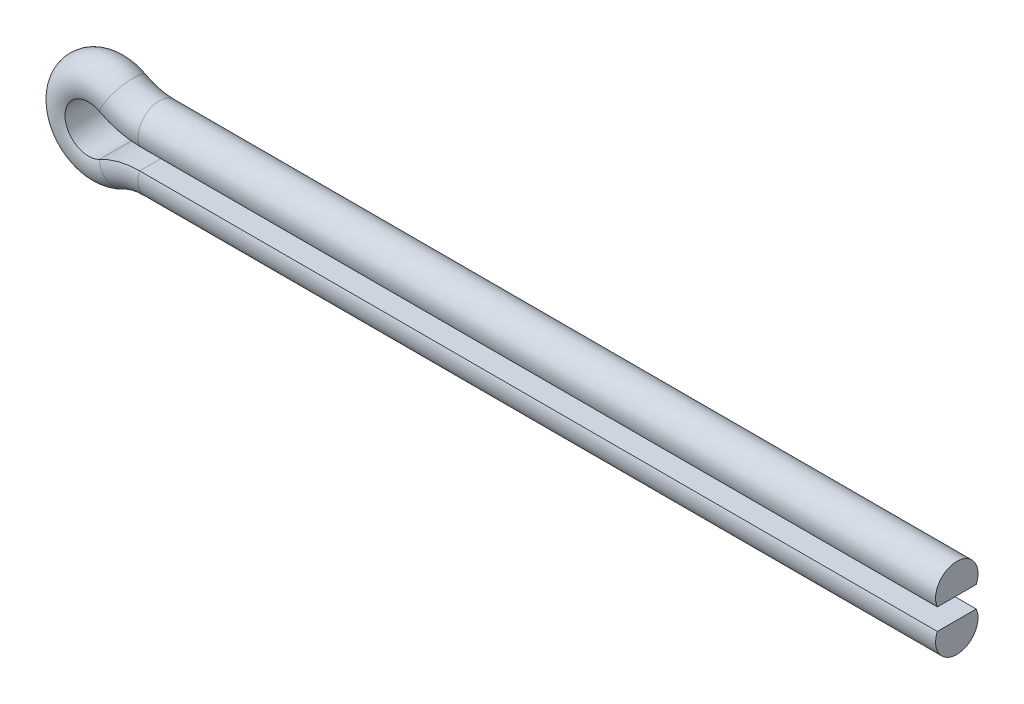
ISO-10303-21;
HEADER;
FILE_DESCRIPTION(('STEP AP214'),'2;1');
FILE_NAME('part.step','',(''),(''),'','','');
FILE_SCHEMA(('AUTOMOTIVE_DESIGN { 1 0 10303 214 1 1 1 1 }'));
ENDSEC;
DATA;
#1=APPLICATION_CONTEXT('core data for automotive mechanical design processes');
#2=APPLICATION_PROTOCOL_DEFINITION('international standard','automotive_design',2000,#1);
#3=PRODUCT_CONTEXT('',#1,'mechanical');
#4=PRODUCT('Part','Part','',(#3));
#5=PRODUCT_RELATED_PRODUCT_CATEGORY('part','',(#4));
#6=PRODUCT_DEFINITION_FORMATION('','',#4);
#7=PRODUCT_DEFINITION_CONTEXT('part definition',#1,'design');
#8=PRODUCT_DEFINITION('design','',#6,#7);
#9=PRODUCT_DEFINITION_SHAPE('','',#8);
#10=(LENGTH_UNIT() NAMED_UNIT(*) SI_UNIT(.MILLI.,.METRE.));
#11=(NAMED_UNIT(*) PLANE_ANGLE_UNIT() SI_UNIT($,.RADIAN.));
#12=(NAMED_UNIT(*) SI_UNIT($,.STERADIAN.) SOLID_ANGLE_UNIT());
#13=UNCERTAINTY_MEASURE_WITH_UNIT(LENGTH_MEASURE(1.E-05),#10,'distance_accuracy_value','');
#14=(GEOMETRIC_REPRESENTATION_CONTEXT(3) GLOBAL_UNCERTAINTY_ASSIGNED_CONTEXT((#13)) GLOBAL_UNIT_ASSIGNED_CONTEXT((#10,
#11,#12)) REPRESENTATION_CONTEXT('',''));
#15=CARTESIAN_POINT('',(0.,0.,0.));
#16=DIRECTION('',(0.,0.,1.));
#17=DIRECTION('',(1.,0.,0.));
#18=AXIS2_PLACEMENT_3D('',#15,#16,#17);
#19=CARTESIAN_POINT('',(100.,-2.25011983898101,0.));
#20=DIRECTION('',(-1.,0.,0.));
#21=DIRECTION('',(0.,-1.,0.));
#22=AXIS2_PLACEMENT_3D('',#19,#20,#21);
#23=PLANE('',#22);
#24=CARTESIAN_POINT('',(100.,-2.25011983898101,0.));
#25=DIRECTION('',(-1.,0.,0.));
#26=DIRECTION('',(0.,-1.,0.));
#27=AXIS2_PLACEMENT_3D('',#24,#25,#26);
#28=CIRCLE('',#27,2.5);
#29=CARTESIAN_POINT('',(100.,-1.25011983898101,-2.29128784747792));
#30=VERTEX_POINT('',#29);
#31=CARTESIAN_POINT('',(100.,-1.25011983898101,2.29128784747792));
#32=VERTEX_POINT('',#31);
#33=EDGE_CURVE('E90',#30,#32,#28,.T.);
#34=ORIENTED_EDGE('',*,*,#33,.F.);
#35=DIRECTION('',(0.,0.,-1.));
#36=VECTOR('',#35,1.);
#37=CARTESIAN_POINT('',(100.,-1.25011983898101,2.29128784747792));
#38=LINE('',#37,#36);
#39=EDGE_CURVE('E92',#32,#30,#38,.T.);
#40=ORIENTED_EDGE('',*,*,#39,.F.);
#41=EDGE_LOOP('',(#34,#40));
#42=FACE_BOUND('',#41,.T.);
#43=ADVANCED_FACE('F43',(#42),#23,.F.);
#44=CARTESIAN_POINT('',(100.,2.25011983898101,0.));
#45=DIRECTION('',(1.,0.,0.));
#46=DIRECTION('',(0.,1.,0.));
#47=AXIS2_PLACEMENT_3D('',#44,#45,#46);
#48=PLANE('',#47);
#49=CARTESIAN_POINT('',(100.,2.25011983898101,0.));
#50=DIRECTION('',(1.,0.,0.));
#51=DIRECTION('',(0.,1.,0.));
#52=AXIS2_PLACEMENT_3D('',#49,#50,#51);
#53=CIRCLE('',#52,2.5);
#54=CARTESIAN_POINT('',(100.,1.25011983898101,-2.29128784747792));
#55=VERTEX_POINT('',#54);
#56=CARTESIAN_POINT('',(100.,1.25011983898101,2.29128784747792));
#57=VERTEX_POINT('',#56);
#58=EDGE_CURVE('E56',#55,#57,#53,.T.);
#59=ORIENTED_EDGE('',*,*,#58,.T.);
#60=DIRECTION('',(0.,0.,-1.));
#61=VECTOR('',#60,1.);
#62=CARTESIAN_POINT('',(100.,1.25011983898101,2.29128784747792));
#63=LINE('',#62,#61);
#64=EDGE_CURVE('E11',#57,#55,#63,.T.);
#65=ORIENTED_EDGE('',*,*,#64,.T.);
#66=EDGE_LOOP('',(#59,#65));
#67=FACE_BOUND('',#66,.T.);
#68=ADVANCED_FACE('F216',(#67),#48,.T.);
#69=CARTESIAN_POINT('',(100.,-2.25011983898101,0.));
#70=DIRECTION('',(-1.,0.,0.));
#71=DIRECTION('',(0.,-1.,0.));
#72=AXIS2_PLACEMENT_3D('',#69,#70,#71);
#73=CYLINDRICAL_SURFACE('',#72,2.5);
#74=DIRECTION('',(-1.,0.,0.));
#75=VECTOR('',#74,1.);
#76=CARTESIAN_POINT('',(100.,-1.25011983898101,2.29128784747792));
#77=LINE('',#76,#75);
#78=CARTESIAN_POINT('',(6.03109484312739,-1.25011983898101,2.29128784747792));
#79=VERTEX_POINT('',#78);
#80=EDGE_CURVE('E104',#32,#79,#77,.T.);
#81=ORIENTED_EDGE('',*,*,#80,.T.);
#82=CARTESIAN_POINT('',(6.03109484312739,-2.25011983898101,0.));
#83=DIRECTION('',(-1.,0.,0.));
#84=DIRECTION('',(0.,-1.,0.));
#85=AXIS2_PLACEMENT_3D('',#82,#83,#84);
#86=CIRCLE('',#85,2.5);
#87=CARTESIAN_POINT('',(6.03109484312739,-1.25011983898101,-2.29128784747792));
#88=VERTEX_POINT('',#87);
#89=EDGE_CURVE('E110',#88,#79,#86,.T.);
#90=ORIENTED_EDGE('',*,*,#89,.F.);
#91=DIRECTION('',(-1.,0.,0.));
#92=VECTOR('',#91,1.);
#93=CARTESIAN_POINT('',(100.,-1.25011983898101,-2.29128784747792));
#94=LINE('',#93,#92);
#95=EDGE_CURVE('E103',#30,#88,#94,.T.);
#96=ORIENTED_EDGE('',*,*,#95,.F.);
#97=ORIENTED_EDGE('',*,*,#33,.T.);
#98=EDGE_LOOP('',(#81,#90,#96,#97));
#99=FACE_BOUND('',#98,.T.);
#100=ADVANCED_FACE('F108',(#99),#73,.T.);
#101=CARTESIAN_POINT('',(100.,-1.25011983898101,2.29128784747792));
#102=DIRECTION('',(0.,1.,0.));
#103=DIRECTION('',(-1.,0.,0.));
#104=AXIS2_PLACEMENT_3D('',#101,#102,#103);
#105=PLANE('',#104);
#106=DIRECTION('',(0.,0.,-1.));
#107=VECTOR('',#106,1.);
#108=CARTESIAN_POINT('',(6.03109484312739,-1.25011983898101,2.29128784747792));
#109=LINE('',#108,#107);
#110=EDGE_CURVE('E130',#79,#88,#109,.T.);
#111=ORIENTED_EDGE('',*,*,#110,.F.);
#112=ORIENTED_EDGE('',*,*,#80,.F.);
#113=ORIENTED_EDGE('',*,*,#39,.T.);
#114=ORIENTED_EDGE('',*,*,#95,.T.);
#115=EDGE_LOOP('',(#111,#112,#113,#114));
#116=FACE_BOUND('',#115,.T.);
#117=ADVANCED_FACE('F102',(#116),#105,.T.);
#118=CARTESIAN_POINT('',(6.03109484312738,-11.25,0.));
#119=DIRECTION('',(0.,0.,1.));
#120=DIRECTION('',(1.,0.,0.));
#121=AXIS2_PLACEMENT_3D('',#118,#119,#120);
#122=TOROIDAL_SURFACE('',#121,8.99988016101899,2.5);
#123=CARTESIAN_POINT('',(6.03109484312738,-11.25,2.29128784747792));
#124=DIRECTION('',(0.,0.,1.));
#125=DIRECTION('',(0.,1.,0.));
#126=AXIS2_PLACEMENT_3D('',#123,#124,#125);
#127=CIRCLE('',#126,9.99988016101899);
#128=CARTESIAN_POINT('',(1.30631450822039,-2.43671150922556,2.29128784747792));
#129=VERTEX_POINT('',#128);
#130=EDGE_CURVE('E121',#79,#129,#127,.T.);
#131=ORIENTED_EDGE('',*,*,#130,.T.);
#132=CARTESIAN_POINT('',(1.77879820390756,-3.31805092018469,0.));
#133=DIRECTION('',(-0.881339410959138,-0.472483695687163,0.));
#134=DIRECTION('',(0.472483695687163,-0.881339410959138,0.));
#135=AXIS2_PLACEMENT_3D('',#132,#133,#134);
#136=CIRCLE('',#135,2.5);
#137=CARTESIAN_POINT('',(1.30631450822039,-2.43671150922556,-2.29128784747792));
#138=VERTEX_POINT('',#137);
#139=EDGE_CURVE('E117',#138,#129,#136,.T.);
#140=ORIENTED_EDGE('',*,*,#139,.F.);
#141=CARTESIAN_POINT('',(6.03109484312738,-11.25,-2.29128784747792));
#142=DIRECTION('',(0.,0.,1.));
#143=DIRECTION('',(0.,1.,0.));
#144=AXIS2_PLACEMENT_3D('',#141,#142,#143);
#145=CIRCLE('',#144,9.99988016101899);
#146=EDGE_CURVE('E122',#88,#138,#145,.T.);
#147=ORIENTED_EDGE('',*,*,#146,.F.);
#148=ORIENTED_EDGE('',*,*,#89,.T.);
#149=EDGE_LOOP('',(#131,#140,#147,#148));
#150=FACE_BOUND('',#149,.T.);
#151=ADVANCED_FACE('F195',(#150),#122,.T.);
#152=CARTESIAN_POINT('',(6.03109484312738,-11.25,0.));
#153=DIRECTION('',(0.,0.,1.));
#154=DIRECTION('',(1.,0.,0.));
#155=AXIS2_PLACEMENT_3D('',#152,#153,#154);
#156=CYLINDRICAL_SURFACE('',#155,9.99988016101899);
#157=DIRECTION('',(0.,0.,-1.));
#158=VECTOR('',#157,1.);
#159=CARTESIAN_POINT('',(1.30631450822039,-2.43671150922555,2.29128784747792));
#160=LINE('',#159,#158);
#161=EDGE_CURVE('E126',#129,#138,#160,.T.);
#162=ORIENTED_EDGE('',*,*,#161,.F.);
#163=ORIENTED_EDGE('',*,*,#130,.F.);
#164=ORIENTED_EDGE('',*,*,#110,.T.);
#165=ORIENTED_EDGE('',*,*,#146,.T.);
#166=EDGE_LOOP('',(#162,#163,#164,#165));
#167=FACE_BOUND('',#166,.T.);
#168=ADVANCED_FACE('F196',(#167),#156,.T.);
#169=CARTESIAN_POINT('',(0.,0.,0.));
#170=DIRECTION('',(0.,0.,-1.));
#171=DIRECTION('',(-1.,0.,0.));
#172=AXIS2_PLACEMENT_3D('',#169,#170,#171);
#173=TOROIDAL_SURFACE('',#172,3.76478219279193,2.5);
#174=CARTESIAN_POINT('',(0.,0.,2.29128784747792));
#175=DIRECTION('',(0.,0.,-1.));
#176=DIRECTION('',(0.472483695687162,-0.881339410959138,0.));
#177=AXIS2_PLACEMENT_3D('',#174,#175,#176);
#178=CIRCLE('',#177,2.76478219279193);
#179=CARTESIAN_POINT('',(1.30631450822038,2.43671150922555,2.29128784747792));
#180=VERTEX_POINT('',#179);
#181=EDGE_CURVE('E135',#129,#180,#178,.T.);
#182=ORIENTED_EDGE('',*,*,#181,.T.);
#183=CARTESIAN_POINT('',(1.77879820390754,3.3180509201847,0.));
#184=DIRECTION('',(0.881339410959139,-0.472483695687162,0.));
#185=DIRECTION('',(0.472483695687162,0.881339410959139,0.));
#186=AXIS2_PLACEMENT_3D('',#183,#184,#185);
#187=CIRCLE('',#186,2.5);
#188=CARTESIAN_POINT('',(1.30631450822038,2.43671150922555,-2.29128784747792));
#189=VERTEX_POINT('',#188);
#190=EDGE_CURVE('E131',#189,#180,#187,.T.);
#191=ORIENTED_EDGE('',*,*,#190,.F.);
#192=CARTESIAN_POINT('',(0.,0.,-2.29128784747792));
#193=DIRECTION('',(0.,0.,-1.));
#194=DIRECTION('',(0.472483695687162,-0.881339410959138,0.));
#195=AXIS2_PLACEMENT_3D('',#192,#193,#194);
#196=CIRCLE('',#195,2.76478219279193);
#197=EDGE_CURVE('E136',#138,#189,#196,.T.);
#198=ORIENTED_EDGE('',*,*,#197,.F.);
#199=ORIENTED_EDGE('',*,*,#139,.T.);
#200=EDGE_LOOP('',(#182,#191,#198,#199));
#201=FACE_BOUND('',#200,.T.);
#202=ADVANCED_FACE('F189',(#201),#173,.T.);
#203=CARTESIAN_POINT('',(0.,0.,0.));
#204=DIRECTION('',(0.,0.,-1.));
#205=DIRECTION('',(-1.,0.,0.));
#206=AXIS2_PLACEMENT_3D('',#203,#204,#205);
#207=CYLINDRICAL_SURFACE('',#206,2.76478219279193);
#208=DIRECTION('',(0.,0.,-1.));
#209=VECTOR('',#208,1.);
#210=CARTESIAN_POINT('',(1.30631450822039,2.43671150922556,2.29128784747792));
#211=LINE('',#210,#209);
#212=EDGE_CURVE('E140',#180,#189,#211,.T.);
#213=ORIENTED_EDGE('',*,*,#212,.F.);
#214=ORIENTED_EDGE('',*,*,#181,.F.);
#215=ORIENTED_EDGE('',*,*,#161,.T.);
#216=ORIENTED_EDGE('',*,*,#197,.T.);
#217=EDGE_LOOP('',(#213,#214,#215,#216));
#218=FACE_BOUND('',#217,.T.);
#219=ADVANCED_FACE('F190',(#218),#207,.F.);
#220=CARTESIAN_POINT('',(6.03109484312738,11.25,0.));
#221=DIRECTION('',(0.,0.,1.));
#222=DIRECTION('',(1.,0.,0.));
#223=AXIS2_PLACEMENT_3D('',#220,#221,#222);
#224=TOROIDAL_SURFACE('',#223,8.99988016101898,2.5);
#225=CARTESIAN_POINT('',(6.03109484312738,11.25,2.29128784747792));
#226=DIRECTION('',(0.,0.,1.));
#227=DIRECTION('',(-0.472483695687164,-0.881339410959138,0.));
#228=AXIS2_PLACEMENT_3D('',#225,#226,#227);
#229=CIRCLE('',#228,9.99988016101899);
#230=CARTESIAN_POINT('',(6.03109484312739,1.25011983898101,2.29128784747792));
#231=VERTEX_POINT('',#230);
#232=EDGE_CURVE('E148',#180,#231,#229,.T.);
#233=ORIENTED_EDGE('',*,*,#232,.T.);
#234=CARTESIAN_POINT('',(6.03109484312739,2.25011983898102,0.));
#235=DIRECTION('',(1.,0.,0.));
#236=DIRECTION('',(0.,1.,0.));
#237=AXIS2_PLACEMENT_3D('',#234,#235,#236);
#238=CIRCLE('',#237,2.5);
#239=CARTESIAN_POINT('',(6.03109484312739,1.25011983898101,-2.29128784747792));
#240=VERTEX_POINT('',#239);
#241=EDGE_CURVE('E144',#240,#231,#238,.T.);
#242=ORIENTED_EDGE('',*,*,#241,.F.);
#243=CARTESIAN_POINT('',(6.03109484312738,11.25,-2.29128784747792));
#244=DIRECTION('',(0.,0.,1.));
#245=DIRECTION('',(-0.472483695687164,-0.881339410959138,0.));
#246=AXIS2_PLACEMENT_3D('',#243,#244,#245);
#247=CIRCLE('',#246,9.99988016101899);
#248=EDGE_CURVE('E149',#189,#240,#247,.T.);
#249=ORIENTED_EDGE('',*,*,#248,.F.);
#250=ORIENTED_EDGE('',*,*,#190,.T.);
#251=EDGE_LOOP('',(#233,#242,#249,#250));
#252=FACE_BOUND('',#251,.T.);
#253=ADVANCED_FACE('F182',(#252),#224,.T.);
#254=CARTESIAN_POINT('',(6.03109484312738,11.25,0.));
#255=DIRECTION('',(0.,0.,1.));
#256=DIRECTION('',(1.,0.,0.));
#257=AXIS2_PLACEMENT_3D('',#254,#255,#256);
#258=CYLINDRICAL_SURFACE('',#257,9.99988016101899);
#259=DIRECTION('',(0.,0.,-1.));
#260=VECTOR('',#259,1.);
#261=CARTESIAN_POINT('',(6.03109484312739,1.25011983898102,2.29128784747792));
#262=LINE('',#261,#260);
#263=EDGE_CURVE('E153',#231,#240,#262,.T.);
#264=ORIENTED_EDGE('',*,*,#263,.F.);
#265=ORIENTED_EDGE('',*,*,#232,.F.);
#266=ORIENTED_EDGE('',*,*,#212,.T.);
#267=ORIENTED_EDGE('',*,*,#248,.T.);
#268=EDGE_LOOP('',(#264,#265,#266,#267));
#269=FACE_BOUND('',#268,.T.);
#270=ADVANCED_FACE('F184',(#269),#258,.T.);
#271=CARTESIAN_POINT('',(6.03109484312739,2.25011983898101,0.));
#272=DIRECTION('',(1.,0.,0.));
#273=DIRECTION('',(0.,1.,0.));
#274=AXIS2_PLACEMENT_3D('',#271,#272,#273);
#275=CYLINDRICAL_SURFACE('',#274,2.5);
#276=DIRECTION('',(1.,0.,0.));
#277=VECTOR('',#276,1.);
#278=CARTESIAN_POINT('',(6.03109484312739,1.25011983898101,2.29128784747792));
#279=LINE('',#278,#277);
#280=EDGE_CURVE('E51',#231,#57,#279,.T.);
#281=ORIENTED_EDGE('',*,*,#280,.T.);
#282=ORIENTED_EDGE('',*,*,#58,.F.);
#283=DIRECTION('',(1.,0.,0.));
#284=VECTOR('',#283,1.);
#285=CARTESIAN_POINT('',(6.03109484312739,1.25011983898101,-2.29128784747792));
#286=LINE('',#285,#284);
#287=EDGE_CURVE('E159',#240,#55,#286,.T.);
#288=ORIENTED_EDGE('',*,*,#287,.F.);
#289=ORIENTED_EDGE('',*,*,#241,.T.);
#290=EDGE_LOOP('',(#281,#282,#288,#289));
#291=FACE_BOUND('',#290,.T.);
#292=ADVANCED_FACE('F209',(#291),#275,.T.);
#293=CARTESIAN_POINT('',(6.03109484312739,1.25011983898101,2.29128784747792));
#294=DIRECTION('',(0.,-1.,0.));
#295=DIRECTION('',(1.,0.,0.));
#296=AXIS2_PLACEMENT_3D('',#293,#294,#295);
#297=PLANE('',#296);
#298=ORIENTED_EDGE('',*,*,#64,.F.);
#299=ORIENTED_EDGE('',*,*,#280,.F.);
#300=ORIENTED_EDGE('',*,*,#263,.T.);
#301=ORIENTED_EDGE('',*,*,#287,.T.);
#302=EDGE_LOOP('',(#298,#299,#300,#301));
#303=FACE_BOUND('',#302,.T.);
#304=ADVANCED_FACE('F179',(#303),#297,.T.);
#305=CLOSED_SHELL('',(#43,#68,#100,#117,#151,#168,#202,#219,#253,#270,#292,#304));
#306=MANIFOLD_SOLID_BREP('B2',#305);
#307=ADVANCED_BREP_SHAPE_REPRESENTATION('',(#18,#306),#14);
#308=SHAPE_DEFINITION_REPRESENTATION(#9,#307);
ENDSEC;
END-ISO-10303-21;
